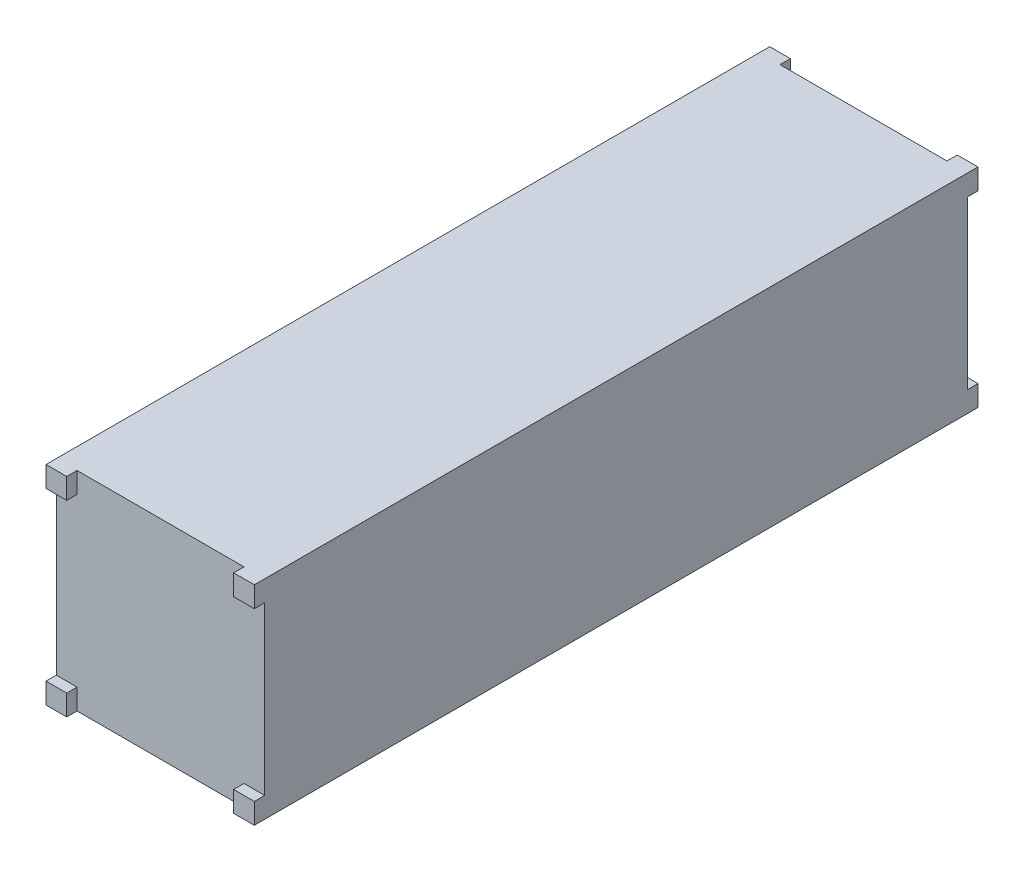
ISO-10303-21;
HEADER;
FILE_DESCRIPTION(('STEP AP214'),'2;1');
FILE_NAME('part.step','',(''),(''),'','','');
FILE_SCHEMA(('AUTOMOTIVE_DESIGN { 1 0 10303 214 1 1 1 1 }'));
ENDSEC;
DATA;
#1=APPLICATION_CONTEXT('core data for automotive mechanical design processes');
#2=APPLICATION_PROTOCOL_DEFINITION('international standard','automotive_design',2000,#1);
#3=PRODUCT_CONTEXT('',#1,'mechanical');
#4=PRODUCT('Part','Part','',(#3));
#5=PRODUCT_RELATED_PRODUCT_CATEGORY('part','',(#4));
#6=PRODUCT_DEFINITION_FORMATION('','',#4);
#7=PRODUCT_DEFINITION_CONTEXT('part definition',#1,'design');
#8=PRODUCT_DEFINITION('design','',#6,#7);
#9=PRODUCT_DEFINITION_SHAPE('','',#8);
#10=(LENGTH_UNIT() NAMED_UNIT(*) SI_UNIT(.MILLI.,.METRE.));
#11=(NAMED_UNIT(*) PLANE_ANGLE_UNIT() SI_UNIT($,.RADIAN.));
#12=(NAMED_UNIT(*) SI_UNIT($,.STERADIAN.) SOLID_ANGLE_UNIT());
#13=UNCERTAINTY_MEASURE_WITH_UNIT(LENGTH_MEASURE(1.E-05),#10,'distance_accuracy_value','');
#14=(GEOMETRIC_REPRESENTATION_CONTEXT(3) GLOBAL_UNCERTAINTY_ASSIGNED_CONTEXT((#13)) GLOBAL_UNIT_ASSIGNED_CONTEXT((#10,
#11,#12)) REPRESENTATION_CONTEXT('',''));
#15=CARTESIAN_POINT('',(0.,0.,0.));
#16=DIRECTION('',(0.,0.,1.));
#17=DIRECTION('',(1.,0.,0.));
#18=AXIS2_PLACEMENT_3D('',#15,#16,#17);
#19=CARTESIAN_POINT('',(0.,0.,-169.75));
#20=DIRECTION('',(0.,0.,1.));
#21=DIRECTION('',(1.,0.,0.));
#22=AXIS2_PLACEMENT_3D('',#19,#20,#21);
#23=PLANE('',#22);
#24=DIRECTION('',(0.,1.,0.));
#25=VECTOR('',#24,1.);
#26=CARTESIAN_POINT('',(40.3,-50.3,-169.75));
#27=LINE('',#26,#25);
#28=CARTESIAN_POINT('',(40.3,-50.3,-169.75));
#29=VERTEX_POINT('',#28);
#30=CARTESIAN_POINT('',(40.3,-40.3,-169.75));
#31=VERTEX_POINT('',#30);
#32=EDGE_CURVE('E240',#29,#31,#27,.T.);
#33=ORIENTED_EDGE('',*,*,#32,.F.);
#34=DIRECTION('',(1.,0.,0.));
#35=VECTOR('',#34,1.);
#36=CARTESIAN_POINT('',(50.3,-50.3,-169.75));
#37=LINE('',#36,#35);
#38=CARTESIAN_POINT('',(-40.2999999999999,-50.3,-169.75));
#39=VERTEX_POINT('',#38);
#40=EDGE_CURVE('E422',#39,#29,#37,.T.);
#41=ORIENTED_EDGE('',*,*,#40,.F.);
#42=DIRECTION('',(0.,-1.,0.));
#43=VECTOR('',#42,1.);
#44=CARTESIAN_POINT('',(-40.3,-50.3,-169.75));
#45=LINE('',#44,#43);
#46=CARTESIAN_POINT('',(-40.3,-40.3000000000001,-169.75));
#47=VERTEX_POINT('',#46);
#48=EDGE_CURVE('E256',#47,#39,#45,.T.);
#49=ORIENTED_EDGE('',*,*,#48,.F.);
#50=DIRECTION('',(1.,0.,0.));
#51=VECTOR('',#50,1.);
#52=CARTESIAN_POINT('',(-50.3,-40.3000000000001,-169.75));
#53=LINE('',#52,#51);
#54=CARTESIAN_POINT('',(-50.3,-40.3000000000001,-169.75));
#55=VERTEX_POINT('',#54);
#56=EDGE_CURVE('E251',#55,#47,#53,.T.);
#57=ORIENTED_EDGE('',*,*,#56,.F.);
#58=DIRECTION('',(0.,-1.,0.));
#59=VECTOR('',#58,1.);
#60=CARTESIAN_POINT('',(-50.3,-50.3,-169.75));
#61=LINE('',#60,#59);
#62=CARTESIAN_POINT('',(-50.3,40.3000000000001,-169.75));
#63=VERTEX_POINT('',#62);
#64=EDGE_CURVE('E409',#63,#55,#61,.T.);
#65=ORIENTED_EDGE('',*,*,#64,.F.);
#66=DIRECTION('',(-1.,0.,0.));
#67=VECTOR('',#66,1.);
#68=CARTESIAN_POINT('',(-50.3,40.3000000000001,-169.75));
#69=LINE('',#68,#67);
#70=CARTESIAN_POINT('',(-40.3,40.3000000000001,-169.75));
#71=VERTEX_POINT('',#70);
#72=EDGE_CURVE('E275',#71,#63,#69,.T.);
#73=ORIENTED_EDGE('',*,*,#72,.F.);
#74=DIRECTION('',(0.,-1.,0.));
#75=VECTOR('',#74,1.);
#76=CARTESIAN_POINT('',(-40.2999999999999,50.3000000000001,-169.75));
#77=LINE('',#76,#75);
#78=CARTESIAN_POINT('',(-40.2999999999999,50.3000000000001,-169.75));
#79=VERTEX_POINT('',#78);
#80=EDGE_CURVE('E270',#79,#71,#77,.T.);
#81=ORIENTED_EDGE('',*,*,#80,.F.);
#82=DIRECTION('',(-1.,0.,0.));
#83=VECTOR('',#82,1.);
#84=CARTESIAN_POINT('',(50.3,50.3,-169.75));
#85=LINE('',#84,#83);
#86=CARTESIAN_POINT('',(40.3,50.3,-169.75));
#87=VERTEX_POINT('',#86);
#88=EDGE_CURVE('E413',#87,#79,#85,.T.);
#89=ORIENTED_EDGE('',*,*,#88,.F.);
#90=DIRECTION('',(0.,1.,0.));
#91=VECTOR('',#90,1.);
#92=CARTESIAN_POINT('',(40.3,50.3,-169.75));
#93=LINE('',#92,#91);
#94=CARTESIAN_POINT('',(40.3,40.3,-169.75));
#95=VERTEX_POINT('',#94);
#96=EDGE_CURVE('E296',#95,#87,#93,.T.);
#97=ORIENTED_EDGE('',*,*,#96,.F.);
#98=DIRECTION('',(-1.,0.,0.));
#99=VECTOR('',#98,1.);
#100=CARTESIAN_POINT('',(50.3,40.3,-169.75));
#101=LINE('',#100,#99);
#102=CARTESIAN_POINT('',(50.3,40.3,-169.75));
#103=VERTEX_POINT('',#102);
#104=EDGE_CURVE('E291',#103,#95,#101,.T.);
#105=ORIENTED_EDGE('',*,*,#104,.F.);
#106=DIRECTION('',(0.,1.,0.));
#107=VECTOR('',#106,1.);
#108=CARTESIAN_POINT('',(50.3,-50.3,-169.75));
#109=LINE('',#108,#107);
#110=CARTESIAN_POINT('',(50.3,-40.3,-169.75));
#111=VERTEX_POINT('',#110);
#112=EDGE_CURVE('E424',#111,#103,#109,.T.);
#113=ORIENTED_EDGE('',*,*,#112,.F.);
#114=DIRECTION('',(1.,0.,0.));
#115=VECTOR('',#114,1.);
#116=CARTESIAN_POINT('',(50.3,-40.3,-169.75));
#117=LINE('',#116,#115);
#118=EDGE_CURVE('E238',#31,#111,#117,.T.);
#119=ORIENTED_EDGE('',*,*,#118,.F.);
#120=EDGE_LOOP('',(#33,#41,#49,#57,#65,#73,#81,#89,#97,#105,#113,#119));
#121=FACE_BOUND('',#120,.T.);
#122=ADVANCED_FACE('F33',(#121),#23,.F.);
#123=CARTESIAN_POINT('',(0.,0.,169.75));
#124=DIRECTION('',(0.,0.,1.));
#125=DIRECTION('',(1.,0.,0.));
#126=AXIS2_PLACEMENT_3D('',#123,#124,#125);
#127=PLANE('',#126);
#128=DIRECTION('',(-1.,0.,0.));
#129=VECTOR('',#128,1.);
#130=CARTESIAN_POINT('',(-50.3,-40.3,169.75));
#131=LINE('',#130,#129);
#132=CARTESIAN_POINT('',(-40.3,-40.3,169.75));
#133=VERTEX_POINT('',#132);
#134=CARTESIAN_POINT('',(-50.3,-40.3,169.75));
#135=VERTEX_POINT('',#134);
#136=EDGE_CURVE('E321',#133,#135,#131,.T.);
#137=ORIENTED_EDGE('',*,*,#136,.F.);
#138=DIRECTION('',(0.,1.,0.));
#139=VECTOR('',#138,1.);
#140=CARTESIAN_POINT('',(-40.3,-50.3,169.75));
#141=LINE('',#140,#139);
#142=CARTESIAN_POINT('',(-40.3,-50.3,169.75));
#143=VERTEX_POINT('',#142);
#144=EDGE_CURVE('E316',#143,#133,#141,.T.);
#145=ORIENTED_EDGE('',*,*,#144,.F.);
#146=DIRECTION('',(1.,0.,0.));
#147=VECTOR('',#146,1.);
#148=CARTESIAN_POINT('',(50.3,-50.3,169.75));
#149=LINE('',#148,#147);
#150=CARTESIAN_POINT('',(40.3,-50.3,169.75));
#151=VERTEX_POINT('',#150);
#152=EDGE_CURVE('E412',#143,#151,#149,.T.);
#153=ORIENTED_EDGE('',*,*,#152,.T.);
#154=DIRECTION('',(0.,-1.,0.));
#155=VECTOR('',#154,1.);
#156=CARTESIAN_POINT('',(40.3,-50.3,169.75));
#157=LINE('',#156,#155);
#158=CARTESIAN_POINT('',(40.3,-40.3,169.75));
#159=VERTEX_POINT('',#158);
#160=EDGE_CURVE('E343',#159,#151,#157,.T.);
#161=ORIENTED_EDGE('',*,*,#160,.F.);
#162=DIRECTION('',(-1.,0.,0.));
#163=VECTOR('',#162,1.);
#164=CARTESIAN_POINT('',(50.3,-40.3,169.75));
#165=LINE('',#164,#163);
#166=CARTESIAN_POINT('',(50.3,-40.3,169.75));
#167=VERTEX_POINT('',#166);
#168=EDGE_CURVE('E340',#167,#159,#165,.T.);
#169=ORIENTED_EDGE('',*,*,#168,.F.);
#170=DIRECTION('',(0.,1.,0.));
#171=VECTOR('',#170,1.);
#172=CARTESIAN_POINT('',(50.3,-50.3,169.75));
#173=LINE('',#172,#171);
#174=CARTESIAN_POINT('',(50.3,40.3,169.75));
#175=VERTEX_POINT('',#174);
#176=EDGE_CURVE('E415',#167,#175,#173,.T.);
#177=ORIENTED_EDGE('',*,*,#176,.T.);
#178=DIRECTION('',(1.,0.,0.));
#179=VECTOR('',#178,1.);
#180=CARTESIAN_POINT('',(50.3,40.3,169.75));
#181=LINE('',#180,#179);
#182=CARTESIAN_POINT('',(40.3,40.3,169.75));
#183=VERTEX_POINT('',#182);
#184=EDGE_CURVE('E367',#183,#175,#181,.T.);
#185=ORIENTED_EDGE('',*,*,#184,.F.);
#186=DIRECTION('',(0.,-1.,0.));
#187=VECTOR('',#186,1.);
#188=CARTESIAN_POINT('',(40.3,50.3,169.75));
#189=LINE('',#188,#187);
#190=CARTESIAN_POINT('',(40.3,50.3,169.75));
#191=VERTEX_POINT('',#190);
#192=EDGE_CURVE('E362',#191,#183,#189,.T.);
#193=ORIENTED_EDGE('',*,*,#192,.F.);
#194=DIRECTION('',(-1.,0.,0.));
#195=VECTOR('',#194,1.);
#196=CARTESIAN_POINT('',(50.3,50.3,169.75));
#197=LINE('',#196,#195);
#198=CARTESIAN_POINT('',(-40.2999999999999,50.3,169.75));
#199=VERTEX_POINT('',#198);
#200=EDGE_CURVE('E417',#191,#199,#197,.T.);
#201=ORIENTED_EDGE('',*,*,#200,.T.);
#202=DIRECTION('',(0.,1.,0.));
#203=VECTOR('',#202,1.);
#204=CARTESIAN_POINT('',(-40.3,50.3,169.75));
#205=LINE('',#204,#203);
#206=CARTESIAN_POINT('',(-40.3,40.3,169.75));
#207=VERTEX_POINT('',#206);
#208=EDGE_CURVE('E389',#207,#199,#205,.T.);
#209=ORIENTED_EDGE('',*,*,#208,.F.);
#210=DIRECTION('',(1.,0.,0.));
#211=VECTOR('',#210,1.);
#212=CARTESIAN_POINT('',(-50.3,40.3,169.75));
#213=LINE('',#212,#211);
#214=CARTESIAN_POINT('',(-50.3,40.3,169.75));
#215=VERTEX_POINT('',#214);
#216=EDGE_CURVE('E384',#215,#207,#213,.T.);
#217=ORIENTED_EDGE('',*,*,#216,.F.);
#218=DIRECTION('',(0.,-1.,0.));
#219=VECTOR('',#218,1.);
#220=CARTESIAN_POINT('',(-50.3,-50.3,169.75));
#221=LINE('',#220,#219);
#222=EDGE_CURVE('E410',#215,#135,#221,.T.);
#223=ORIENTED_EDGE('',*,*,#222,.T.);
#224=EDGE_LOOP('',(#137,#145,#153,#161,#169,#177,#185,#193,#201,#209,#217,#223));
#225=FACE_BOUND('',#224,.T.);
#226=ADVANCED_FACE('F484',(#225),#127,.T.);
#227=CARTESIAN_POINT('',(-50.3,-50.3,169.75));
#228=DIRECTION('',(1.,0.,0.));
#229=DIRECTION('',(0.,0.,-1.));
#230=AXIS2_PLACEMENT_3D('',#227,#228,#229);
#231=PLANE('',#230);
#232=DIRECTION('',(0.,0.,-1.));
#233=VECTOR('',#232,1.);
#234=CARTESIAN_POINT('',(-50.3,50.3,169.75));
#235=LINE('',#234,#233);
#236=CARTESIAN_POINT('',(-50.3,50.3,174.75));
#237=VERTEX_POINT('',#236);
#238=CARTESIAN_POINT('',(-50.2999999999999,50.3000000000001,-174.75));
#239=VERTEX_POINT('',#238);
#240=EDGE_CURVE('E419',#237,#239,#235,.T.);
#241=ORIENTED_EDGE('',*,*,#240,.T.);
#242=DIRECTION('',(0.,1.,0.));
#243=VECTOR('',#242,1.);
#244=CARTESIAN_POINT('',(-50.2999999999999,50.3000000000001,-174.75));
#245=LINE('',#244,#243);
#246=CARTESIAN_POINT('',(-50.3,40.3000000000001,-174.75));
#247=VERTEX_POINT('',#246);
#248=EDGE_CURVE('E271',#247,#239,#245,.T.);
#249=ORIENTED_EDGE('',*,*,#248,.F.);
#250=DIRECTION('',(0.,0.,1.));
#251=VECTOR('',#250,1.);
#252=CARTESIAN_POINT('',(-50.3,40.3000000000001,-174.75));
#253=LINE('',#252,#251);
#254=EDGE_CURVE('E281',#247,#63,#253,.T.);
#255=ORIENTED_EDGE('',*,*,#254,.T.);
#256=ORIENTED_EDGE('',*,*,#64,.T.);
#257=DIRECTION('',(0.,0.,1.));
#258=VECTOR('',#257,1.);
#259=CARTESIAN_POINT('',(-50.3,-40.3000000000001,-174.75));
#260=LINE('',#259,#258);
#261=CARTESIAN_POINT('',(-50.3,-40.3000000000001,-174.75));
#262=VERTEX_POINT('',#261);
#263=EDGE_CURVE('E268',#262,#55,#260,.T.);
#264=ORIENTED_EDGE('',*,*,#263,.F.);
#265=DIRECTION('',(0.,1.,0.));
#266=VECTOR('',#265,1.);
#267=CARTESIAN_POINT('',(-50.3,-50.3000000000001,-174.75));
#268=LINE('',#267,#266);
#269=CARTESIAN_POINT('',(-50.3,-50.3000000000001,-174.75));
#270=VERTEX_POINT('',#269);
#271=EDGE_CURVE('E255',#270,#262,#268,.T.);
#272=ORIENTED_EDGE('',*,*,#271,.F.);
#273=DIRECTION('',(0.,0.,-1.));
#274=VECTOR('',#273,1.);
#275=CARTESIAN_POINT('',(-50.3,-50.3,169.75));
#276=LINE('',#275,#274);
#277=CARTESIAN_POINT('',(-50.3,-50.3,174.75));
#278=VERTEX_POINT('',#277);
#279=EDGE_CURVE('E11',#278,#270,#276,.T.);
#280=ORIENTED_EDGE('',*,*,#279,.F.);
#281=DIRECTION('',(0.,-1.,0.));
#282=VECTOR('',#281,1.);
#283=CARTESIAN_POINT('',(-50.3,-50.3,174.75));
#284=LINE('',#283,#282);
#285=CARTESIAN_POINT('',(-50.3,-40.3,174.75));
#286=VERTEX_POINT('',#285);
#287=EDGE_CURVE('E317',#286,#278,#284,.T.);
#288=ORIENTED_EDGE('',*,*,#287,.F.);
#289=DIRECTION('',(0.,0.,-1.));
#290=VECTOR('',#289,1.);
#291=CARTESIAN_POINT('',(-50.3,-40.3,174.75));
#292=LINE('',#291,#290);
#293=EDGE_CURVE('E327',#286,#135,#292,.T.);
#294=ORIENTED_EDGE('',*,*,#293,.T.);
#295=ORIENTED_EDGE('',*,*,#222,.F.);
#296=DIRECTION('',(0.,0.,-1.));
#297=VECTOR('',#296,1.);
#298=CARTESIAN_POINT('',(-50.3,40.3,174.75));
#299=LINE('',#298,#297);
#300=CARTESIAN_POINT('',(-50.3,40.3,174.75));
#301=VERTEX_POINT('',#300);
#302=EDGE_CURVE('E406',#301,#215,#299,.T.);
#303=ORIENTED_EDGE('',*,*,#302,.F.);
#304=DIRECTION('',(0.,-1.,0.));
#305=VECTOR('',#304,1.);
#306=CARTESIAN_POINT('',(-50.3,50.3,174.75));
#307=LINE('',#306,#305);
#308=EDGE_CURVE('E385',#237,#301,#307,.T.);
#309=ORIENTED_EDGE('',*,*,#308,.F.);
#310=EDGE_LOOP('',(#241,#249,#255,#256,#264,#272,#280,#288,#294,#295,#303,#309));
#311=FACE_BOUND('',#310,.T.);
#312=ADVANCED_FACE('F35',(#311),#231,.F.);
#313=CARTESIAN_POINT('',(50.3,-50.3,169.75));
#314=DIRECTION('',(0.,1.,0.));
#315=DIRECTION('',(0.,0.,1.));
#316=AXIS2_PLACEMENT_3D('',#313,#314,#315);
#317=PLANE('',#316);
#318=ORIENTED_EDGE('',*,*,#279,.T.);
#319=DIRECTION('',(-1.,0.,0.));
#320=VECTOR('',#319,1.);
#321=CARTESIAN_POINT('',(-50.3,-50.3000000000001,-174.75));
#322=LINE('',#321,#320);
#323=CARTESIAN_POINT('',(-40.3,-50.3,-174.75));
#324=VERTEX_POINT('',#323);
#325=EDGE_CURVE('E252',#324,#270,#322,.T.);
#326=ORIENTED_EDGE('',*,*,#325,.F.);
#327=DIRECTION('',(0.,0.,1.));
#328=VECTOR('',#327,1.);
#329=CARTESIAN_POINT('',(-40.3,-50.3,-174.75));
#330=LINE('',#329,#328);
#331=EDGE_CURVE('E56',#324,#39,#330,.T.);
#332=ORIENTED_EDGE('',*,*,#331,.T.);
#333=ORIENTED_EDGE('',*,*,#40,.T.);
#334=DIRECTION('',(0.,0.,1.));
#335=VECTOR('',#334,1.);
#336=CARTESIAN_POINT('',(40.3,-50.3,-174.75));
#337=LINE('',#336,#335);
#338=CARTESIAN_POINT('',(40.3,-50.3,-174.75));
#339=VERTEX_POINT('',#338);
#340=EDGE_CURVE('E230',#339,#29,#337,.T.);
#341=ORIENTED_EDGE('',*,*,#340,.F.);
#342=DIRECTION('',(-1.,0.,0.));
#343=VECTOR('',#342,1.);
#344=CARTESIAN_POINT('',(50.3,-50.3,-174.75));
#345=LINE('',#344,#343);
#346=CARTESIAN_POINT('',(50.3,-50.3,-174.75));
#347=VERTEX_POINT('',#346);
#348=EDGE_CURVE('E228',#347,#339,#345,.T.);
#349=ORIENTED_EDGE('',*,*,#348,.F.);
#350=DIRECTION('',(0.,0.,-1.));
#351=VECTOR('',#350,1.);
#352=CARTESIAN_POINT('',(50.3,-50.3,169.75));
#353=LINE('',#352,#351);
#354=CARTESIAN_POINT('',(50.3,-50.3,174.75));
#355=VERTEX_POINT('',#354);
#356=EDGE_CURVE('E41',#355,#347,#353,.T.);
#357=ORIENTED_EDGE('',*,*,#356,.F.);
#358=DIRECTION('',(1.,0.,0.));
#359=VECTOR('',#358,1.);
#360=CARTESIAN_POINT('',(50.3,-50.3,174.75));
#361=LINE('',#360,#359);
#362=CARTESIAN_POINT('',(40.3,-50.3,174.75));
#363=VERTEX_POINT('',#362);
#364=EDGE_CURVE('E341',#363,#355,#361,.T.);
#365=ORIENTED_EDGE('',*,*,#364,.F.);
#366=DIRECTION('',(0.,0.,-1.));
#367=VECTOR('',#366,1.);
#368=CARTESIAN_POINT('',(40.3,-50.3,174.75));
#369=LINE('',#368,#367);
#370=EDGE_CURVE('E349',#363,#151,#369,.T.);
#371=ORIENTED_EDGE('',*,*,#370,.T.);
#372=ORIENTED_EDGE('',*,*,#152,.F.);
#373=DIRECTION('',(0.,0.,-1.));
#374=VECTOR('',#373,1.);
#375=CARTESIAN_POINT('',(-40.3,-50.3,174.75));
#376=LINE('',#375,#374);
#377=CARTESIAN_POINT('',(-40.3,-50.3,174.75));
#378=VERTEX_POINT('',#377);
#379=EDGE_CURVE('E337',#378,#143,#376,.T.);
#380=ORIENTED_EDGE('',*,*,#379,.F.);
#381=DIRECTION('',(1.,0.,0.));
#382=VECTOR('',#381,1.);
#383=CARTESIAN_POINT('',(-50.3,-50.3,174.75));
#384=LINE('',#383,#382);
#385=EDGE_CURVE('E320',#278,#378,#384,.T.);
#386=ORIENTED_EDGE('',*,*,#385,.F.);
#387=EDGE_LOOP('',(#318,#326,#332,#333,#341,#349,#357,#365,#371,#372,#380,#386));
#388=FACE_BOUND('',#387,.T.);
#389=ADVANCED_FACE('F229',(#388),#317,.F.);
#390=CARTESIAN_POINT('',(50.3,-50.3,169.75));
#391=DIRECTION('',(-1.,0.,0.));
#392=DIRECTION('',(0.,0.,1.));
#393=AXIS2_PLACEMENT_3D('',#390,#391,#392);
#394=PLANE('',#393);
#395=ORIENTED_EDGE('',*,*,#356,.T.);
#396=DIRECTION('',(0.,-1.,0.));
#397=VECTOR('',#396,1.);
#398=CARTESIAN_POINT('',(50.3,-50.3,-174.75));
#399=LINE('',#398,#397);
#400=CARTESIAN_POINT('',(50.3,-40.3,-174.75));
#401=VERTEX_POINT('',#400);
#402=EDGE_CURVE('E221',#401,#347,#399,.T.);
#403=ORIENTED_EDGE('',*,*,#402,.F.);
#404=DIRECTION('',(0.,0.,1.));
#405=VECTOR('',#404,1.);
#406=CARTESIAN_POINT('',(50.3,-40.3,-174.75));
#407=LINE('',#406,#405);
#408=EDGE_CURVE('E48',#401,#111,#407,.T.);
#409=ORIENTED_EDGE('',*,*,#408,.T.);
#410=ORIENTED_EDGE('',*,*,#112,.T.);
#411=DIRECTION('',(0.,0.,1.));
#412=VECTOR('',#411,1.);
#413=CARTESIAN_POINT('',(50.3,40.3,-174.75));
#414=LINE('',#413,#412);
#415=CARTESIAN_POINT('',(50.3,40.3,-174.75));
#416=VERTEX_POINT('',#415);
#417=EDGE_CURVE('E313',#416,#103,#414,.T.);
#418=ORIENTED_EDGE('',*,*,#417,.F.);
#419=DIRECTION('',(0.,-1.,0.));
#420=VECTOR('',#419,1.);
#421=CARTESIAN_POINT('',(50.3,50.3,-174.75));
#422=LINE('',#421,#420);
#423=CARTESIAN_POINT('',(50.3,50.3,-174.75));
#424=VERTEX_POINT('',#423);
#425=EDGE_CURVE('E292',#424,#416,#422,.T.);
#426=ORIENTED_EDGE('',*,*,#425,.F.);
#427=DIRECTION('',(0.,0.,-1.));
#428=VECTOR('',#427,1.);
#429=CARTESIAN_POINT('',(50.3,50.3,169.75));
#430=LINE('',#429,#428);
#431=CARTESIAN_POINT('',(50.3,50.3,174.75));
#432=VERTEX_POINT('',#431);
#433=EDGE_CURVE('E226',#432,#424,#430,.T.);
#434=ORIENTED_EDGE('',*,*,#433,.F.);
#435=DIRECTION('',(0.,1.,0.));
#436=VECTOR('',#435,1.);
#437=CARTESIAN_POINT('',(50.3,50.3,174.75));
#438=LINE('',#437,#436);
#439=CARTESIAN_POINT('',(50.3,40.3,174.75));
#440=VERTEX_POINT('',#439);
#441=EDGE_CURVE('E363',#440,#432,#438,.T.);
#442=ORIENTED_EDGE('',*,*,#441,.F.);
#443=DIRECTION('',(0.,0.,-1.));
#444=VECTOR('',#443,1.);
#445=CARTESIAN_POINT('',(50.3,40.3,174.75));
#446=LINE('',#445,#444);
#447=EDGE_CURVE('E373',#440,#175,#446,.T.);
#448=ORIENTED_EDGE('',*,*,#447,.T.);
#449=ORIENTED_EDGE('',*,*,#176,.F.);
#450=DIRECTION('',(0.,0.,-1.));
#451=VECTOR('',#450,1.);
#452=CARTESIAN_POINT('',(50.3,-40.3,174.75));
#453=LINE('',#452,#451);
#454=CARTESIAN_POINT('',(50.3,-40.3,174.75));
#455=VERTEX_POINT('',#454);
#456=EDGE_CURVE('E359',#455,#167,#453,.T.);
#457=ORIENTED_EDGE('',*,*,#456,.F.);
#458=DIRECTION('',(0.,1.,0.));
#459=VECTOR('',#458,1.);
#460=CARTESIAN_POINT('',(50.3,-50.3,174.75));
#461=LINE('',#460,#459);
#462=EDGE_CURVE('E223',#355,#455,#461,.T.);
#463=ORIENTED_EDGE('',*,*,#462,.F.);
#464=EDGE_LOOP('',(#395,#403,#409,#410,#418,#426,#434,#442,#448,#449,#457,#463));
#465=FACE_BOUND('',#464,.T.);
#466=ADVANCED_FACE('F219',(#465),#394,.F.);
#467=CARTESIAN_POINT('',(50.3,50.3,169.75));
#468=DIRECTION('',(0.,-1.,0.));
#469=DIRECTION('',(1.,0.,0.));
#470=AXIS2_PLACEMENT_3D('',#467,#468,#469);
#471=PLANE('',#470);
#472=ORIENTED_EDGE('',*,*,#433,.T.);
#473=DIRECTION('',(1.,0.,0.));
#474=VECTOR('',#473,1.);
#475=CARTESIAN_POINT('',(50.3,50.3,-174.75));
#476=LINE('',#475,#474);
#477=CARTESIAN_POINT('',(40.3,50.3,-174.75));
#478=VERTEX_POINT('',#477);
#479=EDGE_CURVE('E300',#478,#424,#476,.T.);
#480=ORIENTED_EDGE('',*,*,#479,.F.);
#481=DIRECTION('',(0.,0.,1.));
#482=VECTOR('',#481,1.);
#483=CARTESIAN_POINT('',(40.3,50.3,-174.75));
#484=LINE('',#483,#482);
#485=EDGE_CURVE('E303',#478,#87,#484,.T.);
#486=ORIENTED_EDGE('',*,*,#485,.T.);
#487=ORIENTED_EDGE('',*,*,#88,.T.);
#488=DIRECTION('',(0.,0.,1.));
#489=VECTOR('',#488,1.);
#490=CARTESIAN_POINT('',(-40.2999999999999,50.3000000000001,-174.75));
#491=LINE('',#490,#489);
#492=CARTESIAN_POINT('',(-40.2999999999999,50.3000000000001,-174.75));
#493=VERTEX_POINT('',#492);
#494=EDGE_CURVE('E289',#493,#79,#491,.T.);
#495=ORIENTED_EDGE('',*,*,#494,.F.);
#496=DIRECTION('',(1.,0.,0.));
#497=VECTOR('',#496,1.);
#498=CARTESIAN_POINT('',(-50.2999999999999,50.3000000000001,-174.75));
#499=LINE('',#498,#497);
#500=EDGE_CURVE('E274',#239,#493,#499,.T.);
#501=ORIENTED_EDGE('',*,*,#500,.F.);
#502=ORIENTED_EDGE('',*,*,#240,.F.);
#503=DIRECTION('',(-1.,0.,0.));
#504=VECTOR('',#503,1.);
#505=CARTESIAN_POINT('',(-50.3,50.3,174.75));
#506=LINE('',#505,#504);
#507=CARTESIAN_POINT('',(-40.3,50.3,174.75));
#508=VERTEX_POINT('',#507);
#509=EDGE_CURVE('E393',#508,#237,#506,.T.);
#510=ORIENTED_EDGE('',*,*,#509,.F.);
#511=DIRECTION('',(0.,0.,-1.));
#512=VECTOR('',#511,1.);
#513=CARTESIAN_POINT('',(-40.3,50.3,174.75));
#514=LINE('',#513,#512);
#515=EDGE_CURVE('E396',#508,#199,#514,.T.);
#516=ORIENTED_EDGE('',*,*,#515,.T.);
#517=ORIENTED_EDGE('',*,*,#200,.F.);
#518=DIRECTION('',(0.,0.,-1.));
#519=VECTOR('',#518,1.);
#520=CARTESIAN_POINT('',(40.3,50.3,174.75));
#521=LINE('',#520,#519);
#522=CARTESIAN_POINT('',(40.3,50.3,174.75));
#523=VERTEX_POINT('',#522);
#524=EDGE_CURVE('E382',#523,#191,#521,.T.);
#525=ORIENTED_EDGE('',*,*,#524,.F.);
#526=DIRECTION('',(-1.,0.,0.));
#527=VECTOR('',#526,1.);
#528=CARTESIAN_POINT('',(50.3,50.3,174.75));
#529=LINE('',#528,#527);
#530=EDGE_CURVE('E366',#432,#523,#529,.T.);
#531=ORIENTED_EDGE('',*,*,#530,.F.);
#532=EDGE_LOOP('',(#472,#480,#486,#487,#495,#501,#502,#510,#516,#517,#525,#531));
#533=FACE_BOUND('',#532,.T.);
#534=ADVANCED_FACE('F432',(#533),#471,.F.);
#535=CARTESIAN_POINT('',(-50.3,40.3,174.75));
#536=DIRECTION('',(0.,1.,0.));
#537=DIRECTION('',(0.,0.,1.));
#538=AXIS2_PLACEMENT_3D('',#535,#536,#537);
#539=PLANE('',#538);
#540=ORIENTED_EDGE('',*,*,#216,.T.);
#541=DIRECTION('',(0.,0.,-1.));
#542=VECTOR('',#541,1.);
#543=CARTESIAN_POINT('',(-40.3,40.3,174.75));
#544=LINE('',#543,#542);
#545=CARTESIAN_POINT('',(-40.3,40.3,174.75));
#546=VERTEX_POINT('',#545);
#547=EDGE_CURVE('E403',#546,#207,#544,.T.);
#548=ORIENTED_EDGE('',*,*,#547,.F.);
#549=DIRECTION('',(1.,0.,0.));
#550=VECTOR('',#549,1.);
#551=CARTESIAN_POINT('',(-50.3,40.3,174.75));
#552=LINE('',#551,#550);
#553=EDGE_CURVE('E388',#301,#546,#552,.T.);
#554=ORIENTED_EDGE('',*,*,#553,.F.);
#555=ORIENTED_EDGE('',*,*,#302,.T.);
#556=EDGE_LOOP('',(#540,#548,#554,#555));
#557=FACE_BOUND('',#556,.T.);
#558=ADVANCED_FACE('F476',(#557),#539,.F.);
#559=CARTESIAN_POINT('',(-40.3,50.3,174.75));
#560=DIRECTION('',(-1.,0.,0.));
#561=DIRECTION('',(0.,0.,1.));
#562=AXIS2_PLACEMENT_3D('',#559,#560,#561);
#563=PLANE('',#562);
#564=ORIENTED_EDGE('',*,*,#208,.T.);
#565=ORIENTED_EDGE('',*,*,#515,.F.);
#566=DIRECTION('',(0.,1.,0.));
#567=VECTOR('',#566,1.);
#568=CARTESIAN_POINT('',(-40.3,50.3,174.75));
#569=LINE('',#568,#567);
#570=EDGE_CURVE('E391',#546,#508,#569,.T.);
#571=ORIENTED_EDGE('',*,*,#570,.F.);
#572=ORIENTED_EDGE('',*,*,#547,.T.);
#573=EDGE_LOOP('',(#564,#565,#571,#572));
#574=FACE_BOUND('',#573,.T.);
#575=ADVANCED_FACE('F479',(#574),#563,.F.);
#576=CARTESIAN_POINT('',(0.,0.,174.75));
#577=DIRECTION('',(0.,0.,1.));
#578=DIRECTION('',(1.,0.,0.));
#579=AXIS2_PLACEMENT_3D('',#576,#577,#578);
#580=PLANE('',#579);
#581=ORIENTED_EDGE('',*,*,#308,.T.);
#582=ORIENTED_EDGE('',*,*,#553,.T.);
#583=ORIENTED_EDGE('',*,*,#570,.T.);
#584=ORIENTED_EDGE('',*,*,#509,.T.);
#585=EDGE_LOOP('',(#581,#582,#583,#584));
#586=FACE_BOUND('',#585,.T.);
#587=ADVANCED_FACE('F470',(#586),#580,.T.);
#588=CARTESIAN_POINT('',(40.3,50.3,174.75));
#589=DIRECTION('',(1.,0.,0.));
#590=DIRECTION('',(0.,0.,-1.));
#591=AXIS2_PLACEMENT_3D('',#588,#589,#590);
#592=PLANE('',#591);
#593=ORIENTED_EDGE('',*,*,#192,.T.);
#594=DIRECTION('',(0.,0.,-1.));
#595=VECTOR('',#594,1.);
#596=CARTESIAN_POINT('',(40.3,40.3,174.75));
#597=LINE('',#596,#595);
#598=CARTESIAN_POINT('',(40.3,40.3,174.75));
#599=VERTEX_POINT('',#598);
#600=EDGE_CURVE('E380',#599,#183,#597,.T.);
#601=ORIENTED_EDGE('',*,*,#600,.F.);
#602=DIRECTION('',(0.,-1.,0.));
#603=VECTOR('',#602,1.);
#604=CARTESIAN_POINT('',(40.3,50.3,174.75));
#605=LINE('',#604,#603);
#606=EDGE_CURVE('E369',#523,#599,#605,.T.);
#607=ORIENTED_EDGE('',*,*,#606,.F.);
#608=ORIENTED_EDGE('',*,*,#524,.T.);
#609=EDGE_LOOP('',(#593,#601,#607,#608));
#610=FACE_BOUND('',#609,.T.);
#611=ADVANCED_FACE('F488',(#610),#592,.F.);
#612=CARTESIAN_POINT('',(50.3,40.3,174.75));
#613=DIRECTION('',(0.,1.,0.));
#614=DIRECTION('',(-1.,0.,0.));
#615=AXIS2_PLACEMENT_3D('',#612,#613,#614);
#616=PLANE('',#615);
#617=ORIENTED_EDGE('',*,*,#184,.T.);
#618=ORIENTED_EDGE('',*,*,#447,.F.);
#619=DIRECTION('',(1.,0.,0.));
#620=VECTOR('',#619,1.);
#621=CARTESIAN_POINT('',(50.3,40.3,174.75));
#622=LINE('',#621,#620);
#623=EDGE_CURVE('E371',#599,#440,#622,.T.);
#624=ORIENTED_EDGE('',*,*,#623,.F.);
#625=ORIENTED_EDGE('',*,*,#600,.T.);
#626=EDGE_LOOP('',(#617,#618,#624,#625));
#627=FACE_BOUND('',#626,.T.);
#628=ADVANCED_FACE('F495',(#627),#616,.F.);
#629=CARTESIAN_POINT('',(0.,0.,174.75));
#630=DIRECTION('',(0.,0.,-1.));
#631=DIRECTION('',(-1.,0.,0.));
#632=AXIS2_PLACEMENT_3D('',#629,#630,#631);
#633=PLANE('',#632);
#634=ORIENTED_EDGE('',*,*,#441,.T.);
#635=ORIENTED_EDGE('',*,*,#530,.T.);
#636=ORIENTED_EDGE('',*,*,#606,.T.);
#637=ORIENTED_EDGE('',*,*,#623,.T.);
#638=EDGE_LOOP('',(#634,#635,#636,#637));
#639=FACE_BOUND('',#638,.T.);
#640=ADVANCED_FACE('F491',(#639),#633,.F.);
#641=CARTESIAN_POINT('',(50.3,-40.3,174.75));
#642=DIRECTION('',(0.,-1.,0.));
#643=DIRECTION('',(1.,0.,0.));
#644=AXIS2_PLACEMENT_3D('',#641,#642,#643);
#645=PLANE('',#644);
#646=ORIENTED_EDGE('',*,*,#168,.T.);
#647=DIRECTION('',(0.,0.,-1.));
#648=VECTOR('',#647,1.);
#649=CARTESIAN_POINT('',(40.3,-40.3,174.75));
#650=LINE('',#649,#648);
#651=CARTESIAN_POINT('',(40.3,-40.3,174.75));
#652=VERTEX_POINT('',#651);
#653=EDGE_CURVE('E356',#652,#159,#650,.T.);
#654=ORIENTED_EDGE('',*,*,#653,.F.);
#655=DIRECTION('',(-1.,0.,0.));
#656=VECTOR('',#655,1.);
#657=CARTESIAN_POINT('',(50.3,-40.3,174.75));
#658=LINE('',#657,#656);
#659=EDGE_CURVE('E345',#455,#652,#658,.T.);
#660=ORIENTED_EDGE('',*,*,#659,.F.);
#661=ORIENTED_EDGE('',*,*,#456,.T.);
#662=EDGE_LOOP('',(#646,#654,#660,#661));
#663=FACE_BOUND('',#662,.T.);
#664=ADVANCED_FACE('F502',(#663),#645,.F.);
#665=CARTESIAN_POINT('',(40.3,-50.3,174.75));
#666=DIRECTION('',(1.,0.,0.));
#667=DIRECTION('',(0.,0.,-1.));
#668=AXIS2_PLACEMENT_3D('',#665,#666,#667);
#669=PLANE('',#668);
#670=ORIENTED_EDGE('',*,*,#160,.T.);
#671=ORIENTED_EDGE('',*,*,#370,.F.);
#672=DIRECTION('',(0.,-1.,0.));
#673=VECTOR('',#672,1.);
#674=CARTESIAN_POINT('',(40.3,-50.3,174.75));
#675=LINE('',#674,#673);
#676=EDGE_CURVE('E347',#652,#363,#675,.T.);
#677=ORIENTED_EDGE('',*,*,#676,.F.);
#678=ORIENTED_EDGE('',*,*,#653,.T.);
#679=EDGE_LOOP('',(#670,#671,#677,#678));
#680=FACE_BOUND('',#679,.T.);
#681=ADVANCED_FACE('F577',(#680),#669,.F.);
#682=CARTESIAN_POINT('',(0.,0.,174.75));
#683=DIRECTION('',(0.,0.,-1.));
#684=DIRECTION('',(-1.,0.,0.));
#685=AXIS2_PLACEMENT_3D('',#682,#683,#684);
#686=PLANE('',#685);
#687=ORIENTED_EDGE('',*,*,#364,.T.);
#688=ORIENTED_EDGE('',*,*,#462,.T.);
#689=ORIENTED_EDGE('',*,*,#659,.T.);
#690=ORIENTED_EDGE('',*,*,#676,.T.);
#691=EDGE_LOOP('',(#687,#688,#689,#690));
#692=FACE_BOUND('',#691,.T.);
#693=ADVANCED_FACE('F587',(#692),#686,.F.);
#694=CARTESIAN_POINT('',(-40.3,-50.3,174.75));
#695=DIRECTION('',(-1.,0.,0.));
#696=DIRECTION('',(0.,0.,1.));
#697=AXIS2_PLACEMENT_3D('',#694,#695,#696);
#698=PLANE('',#697);
#699=ORIENTED_EDGE('',*,*,#144,.T.);
#700=DIRECTION('',(0.,0.,-1.));
#701=VECTOR('',#700,1.);
#702=CARTESIAN_POINT('',(-40.3,-40.3,174.75));
#703=LINE('',#702,#701);
#704=CARTESIAN_POINT('',(-40.3,-40.3,174.75));
#705=VERTEX_POINT('',#704);
#706=EDGE_CURVE('E334',#705,#133,#703,.T.);
#707=ORIENTED_EDGE('',*,*,#706,.F.);
#708=DIRECTION('',(0.,1.,0.));
#709=VECTOR('',#708,1.);
#710=CARTESIAN_POINT('',(-40.3,-50.3,174.75));
#711=LINE('',#710,#709);
#712=EDGE_CURVE('E323',#378,#705,#711,.T.);
#713=ORIENTED_EDGE('',*,*,#712,.F.);
#714=ORIENTED_EDGE('',*,*,#379,.T.);
#715=EDGE_LOOP('',(#699,#707,#713,#714));
#716=FACE_BOUND('',#715,.T.);
#717=ADVANCED_FACE('F597',(#716),#698,.F.);
#718=CARTESIAN_POINT('',(-50.3,-40.3,174.75));
#719=DIRECTION('',(0.,-1.,0.));
#720=DIRECTION('',(0.,0.,-1.));
#721=AXIS2_PLACEMENT_3D('',#718,#719,#720);
#722=PLANE('',#721);
#723=ORIENTED_EDGE('',*,*,#136,.T.);
#724=ORIENTED_EDGE('',*,*,#293,.F.);
#725=DIRECTION('',(-1.,0.,0.));
#726=VECTOR('',#725,1.);
#727=CARTESIAN_POINT('',(-50.3,-40.3,174.75));
#728=LINE('',#727,#726);
#729=EDGE_CURVE('E325',#705,#286,#728,.T.);
#730=ORIENTED_EDGE('',*,*,#729,.F.);
#731=ORIENTED_EDGE('',*,*,#706,.T.);
#732=EDGE_LOOP('',(#723,#724,#730,#731));
#733=FACE_BOUND('',#732,.T.);
#734=ADVANCED_FACE('F607',(#733),#722,.F.);
#735=CARTESIAN_POINT('',(0.,0.,174.75));
#736=DIRECTION('',(0.,0.,-1.));
#737=DIRECTION('',(-1.,0.,0.));
#738=AXIS2_PLACEMENT_3D('',#735,#736,#737);
#739=PLANE('',#738);
#740=ORIENTED_EDGE('',*,*,#287,.T.);
#741=ORIENTED_EDGE('',*,*,#385,.T.);
#742=ORIENTED_EDGE('',*,*,#712,.T.);
#743=ORIENTED_EDGE('',*,*,#729,.T.);
#744=EDGE_LOOP('',(#740,#741,#742,#743));
#745=FACE_BOUND('',#744,.T.);
#746=ADVANCED_FACE('F617',(#745),#739,.F.);
#747=CARTESIAN_POINT('',(50.3,40.3,-174.75));
#748=DIRECTION('',(0.,1.,0.));
#749=DIRECTION('',(0.,0.,1.));
#750=AXIS2_PLACEMENT_3D('',#747,#748,#749);
#751=PLANE('',#750);
#752=ORIENTED_EDGE('',*,*,#104,.T.);
#753=DIRECTION('',(0.,0.,1.));
#754=VECTOR('',#753,1.);
#755=CARTESIAN_POINT('',(40.3,40.3,-174.75));
#756=LINE('',#755,#754);
#757=CARTESIAN_POINT('',(40.3,40.3,-174.75));
#758=VERTEX_POINT('',#757);
#759=EDGE_CURVE('E310',#758,#95,#756,.T.);
#760=ORIENTED_EDGE('',*,*,#759,.F.);
#761=DIRECTION('',(-1.,0.,0.));
#762=VECTOR('',#761,1.);
#763=CARTESIAN_POINT('',(50.3,40.3,-174.75));
#764=LINE('',#763,#762);
#765=EDGE_CURVE('E295',#416,#758,#764,.T.);
#766=ORIENTED_EDGE('',*,*,#765,.F.);
#767=ORIENTED_EDGE('',*,*,#417,.T.);
#768=EDGE_LOOP('',(#752,#760,#766,#767));
#769=FACE_BOUND('',#768,.T.);
#770=ADVANCED_FACE('F444',(#769),#751,.F.);
#771=CARTESIAN_POINT('',(40.3,50.3,-174.75));
#772=DIRECTION('',(1.,0.,0.));
#773=DIRECTION('',(0.,0.,-1.));
#774=AXIS2_PLACEMENT_3D('',#771,#772,#773);
#775=PLANE('',#774);
#776=ORIENTED_EDGE('',*,*,#96,.T.);
#777=ORIENTED_EDGE('',*,*,#485,.F.);
#778=DIRECTION('',(0.,1.,0.));
#779=VECTOR('',#778,1.);
#780=CARTESIAN_POINT('',(40.3,50.3,-174.75));
#781=LINE('',#780,#779);
#782=EDGE_CURVE('E298',#758,#478,#781,.T.);
#783=ORIENTED_EDGE('',*,*,#782,.F.);
#784=ORIENTED_EDGE('',*,*,#759,.T.);
#785=EDGE_LOOP('',(#776,#777,#783,#784));
#786=FACE_BOUND('',#785,.T.);
#787=ADVANCED_FACE('F447',(#786),#775,.F.);
#788=CARTESIAN_POINT('',(0.,0.,-174.75));
#789=DIRECTION('',(0.,0.,-1.));
#790=DIRECTION('',(-1.,0.,0.));
#791=AXIS2_PLACEMENT_3D('',#788,#789,#790);
#792=PLANE('',#791);
#793=ORIENTED_EDGE('',*,*,#425,.T.);
#794=ORIENTED_EDGE('',*,*,#765,.T.);
#795=ORIENTED_EDGE('',*,*,#782,.T.);
#796=ORIENTED_EDGE('',*,*,#479,.T.);
#797=EDGE_LOOP('',(#793,#794,#795,#796));
#798=FACE_BOUND('',#797,.T.);
#799=ADVANCED_FACE('F437',(#798),#792,.T.);
#800=CARTESIAN_POINT('',(-40.2999999999999,50.3000000000001,-174.75));
#801=DIRECTION('',(-1.,0.,0.));
#802=DIRECTION('',(0.,-1.,0.));
#803=AXIS2_PLACEMENT_3D('',#800,#801,#802);
#804=PLANE('',#803);
#805=ORIENTED_EDGE('',*,*,#80,.T.);
#806=DIRECTION('',(0.,0.,1.));
#807=VECTOR('',#806,1.);
#808=CARTESIAN_POINT('',(-40.3,40.3000000000001,-174.75));
#809=LINE('',#808,#807);
#810=CARTESIAN_POINT('',(-40.3,40.3000000000001,-174.75));
#811=VERTEX_POINT('',#810);
#812=EDGE_CURVE('E286',#811,#71,#809,.T.);
#813=ORIENTED_EDGE('',*,*,#812,.F.);
#814=DIRECTION('',(0.,-1.,0.));
#815=VECTOR('',#814,1.);
#816=CARTESIAN_POINT('',(-40.2999999999999,50.3000000000001,-174.75));
#817=LINE('',#816,#815);
#818=EDGE_CURVE('E277',#493,#811,#817,.T.);
#819=ORIENTED_EDGE('',*,*,#818,.F.);
#820=ORIENTED_EDGE('',*,*,#494,.T.);
#821=EDGE_LOOP('',(#805,#813,#819,#820));
#822=FACE_BOUND('',#821,.T.);
#823=ADVANCED_FACE('F458',(#822),#804,.F.);
#824=CARTESIAN_POINT('',(-50.3,40.3000000000001,-174.75));
#825=DIRECTION('',(0.,1.,0.));
#826=DIRECTION('',(-1.,0.,0.));
#827=AXIS2_PLACEMENT_3D('',#824,#825,#826);
#828=PLANE('',#827);
#829=ORIENTED_EDGE('',*,*,#72,.T.);
#830=ORIENTED_EDGE('',*,*,#254,.F.);
#831=DIRECTION('',(-1.,0.,0.));
#832=VECTOR('',#831,1.);
#833=CARTESIAN_POINT('',(-50.3,40.3000000000001,-174.75));
#834=LINE('',#833,#832);
#835=EDGE_CURVE('E279',#811,#247,#834,.T.);
#836=ORIENTED_EDGE('',*,*,#835,.F.);
#837=ORIENTED_EDGE('',*,*,#812,.T.);
#838=EDGE_LOOP('',(#829,#830,#836,#837));
#839=FACE_BOUND('',#838,.T.);
#840=ADVANCED_FACE('F461',(#839),#828,.F.);
#841=CARTESIAN_POINT('',(0.,0.,-174.75));
#842=DIRECTION('',(0.,0.,1.));
#843=DIRECTION('',(1.,0.,0.));
#844=AXIS2_PLACEMENT_3D('',#841,#842,#843);
#845=PLANE('',#844);
#846=ORIENTED_EDGE('',*,*,#248,.T.);
#847=ORIENTED_EDGE('',*,*,#500,.T.);
#848=ORIENTED_EDGE('',*,*,#818,.T.);
#849=ORIENTED_EDGE('',*,*,#835,.T.);
#850=EDGE_LOOP('',(#846,#847,#848,#849));
#851=FACE_BOUND('',#850,.T.);
#852=ADVANCED_FACE('F465',(#851),#845,.F.);
#853=CARTESIAN_POINT('',(-50.3,-40.3000000000001,-174.75));
#854=DIRECTION('',(0.,-1.,0.));
#855=DIRECTION('',(1.,0.,0.));
#856=AXIS2_PLACEMENT_3D('',#853,#854,#855);
#857=PLANE('',#856);
#858=ORIENTED_EDGE('',*,*,#56,.T.);
#859=DIRECTION('',(0.,0.,1.));
#860=VECTOR('',#859,1.);
#861=CARTESIAN_POINT('',(-40.3,-40.3000000000001,-174.75));
#862=LINE('',#861,#860);
#863=CARTESIAN_POINT('',(-40.3,-40.3000000000001,-174.75));
#864=VERTEX_POINT('',#863);
#865=EDGE_CURVE('E265',#864,#47,#862,.T.);
#866=ORIENTED_EDGE('',*,*,#865,.F.);
#867=DIRECTION('',(1.,0.,0.));
#868=VECTOR('',#867,1.);
#869=CARTESIAN_POINT('',(-50.3,-40.3000000000001,-174.75));
#870=LINE('',#869,#868);
#871=EDGE_CURVE('E258',#262,#864,#870,.T.);
#872=ORIENTED_EDGE('',*,*,#871,.F.);
#873=ORIENTED_EDGE('',*,*,#263,.T.);
#874=EDGE_LOOP('',(#858,#866,#872,#873));
#875=FACE_BOUND('',#874,.T.);
#876=ADVANCED_FACE('F718',(#875),#857,.F.);
#877=CARTESIAN_POINT('',(-40.3,-50.3,-174.75));
#878=DIRECTION('',(-1.,0.,0.));
#879=DIRECTION('',(0.,-1.,0.));
#880=AXIS2_PLACEMENT_3D('',#877,#878,#879);
#881=PLANE('',#880);
#882=ORIENTED_EDGE('',*,*,#48,.T.);
#883=ORIENTED_EDGE('',*,*,#331,.F.);
#884=DIRECTION('',(0.,-1.,0.));
#885=VECTOR('',#884,1.);
#886=CARTESIAN_POINT('',(-40.3,-50.3,-174.75));
#887=LINE('',#886,#885);
#888=EDGE_CURVE('E260',#864,#324,#887,.T.);
#889=ORIENTED_EDGE('',*,*,#888,.F.);
#890=ORIENTED_EDGE('',*,*,#865,.T.);
#891=EDGE_LOOP('',(#882,#883,#889,#890));
#892=FACE_BOUND('',#891,.T.);
#893=ADVANCED_FACE('F726',(#892),#881,.F.);
#894=CARTESIAN_POINT('',(0.,0.,-174.75));
#895=DIRECTION('',(0.,0.,1.));
#896=DIRECTION('',(1.,0.,0.));
#897=AXIS2_PLACEMENT_3D('',#894,#895,#896);
#898=PLANE('',#897);
#899=ORIENTED_EDGE('',*,*,#325,.T.);
#900=ORIENTED_EDGE('',*,*,#271,.T.);
#901=ORIENTED_EDGE('',*,*,#871,.T.);
#902=ORIENTED_EDGE('',*,*,#888,.T.);
#903=EDGE_LOOP('',(#899,#900,#901,#902));
#904=FACE_BOUND('',#903,.T.);
#905=ADVANCED_FACE('F735',(#904),#898,.F.);
#906=CARTESIAN_POINT('',(40.3,-50.3,-174.75));
#907=DIRECTION('',(1.,0.,0.));
#908=DIRECTION('',(0.,0.,-1.));
#909=AXIS2_PLACEMENT_3D('',#906,#907,#908);
#910=PLANE('',#909);
#911=ORIENTED_EDGE('',*,*,#32,.T.);
#912=DIRECTION('',(0.,0.,1.));
#913=VECTOR('',#912,1.);
#914=CARTESIAN_POINT('',(40.3,-40.3,-174.75));
#915=LINE('',#914,#913);
#916=CARTESIAN_POINT('',(40.3,-40.3,-174.75));
#917=VERTEX_POINT('',#916);
#918=EDGE_CURVE('E247',#917,#31,#915,.T.);
#919=ORIENTED_EDGE('',*,*,#918,.F.);
#920=DIRECTION('',(0.,1.,0.));
#921=VECTOR('',#920,1.);
#922=CARTESIAN_POINT('',(40.3,-50.3,-174.75));
#923=LINE('',#922,#921);
#924=EDGE_CURVE('E233',#339,#917,#923,.T.);
#925=ORIENTED_EDGE('',*,*,#924,.F.);
#926=ORIENTED_EDGE('',*,*,#340,.T.);
#927=EDGE_LOOP('',(#911,#919,#925,#926));
#928=FACE_BOUND('',#927,.T.);
#929=ADVANCED_FACE('F744',(#928),#910,.F.);
#930=CARTESIAN_POINT('',(50.3,-40.3,-174.75));
#931=DIRECTION('',(0.,-1.,0.));
#932=DIRECTION('',(0.,0.,-1.));
#933=AXIS2_PLACEMENT_3D('',#930,#931,#932);
#934=PLANE('',#933);
#935=ORIENTED_EDGE('',*,*,#118,.T.);
#936=ORIENTED_EDGE('',*,*,#408,.F.);
#937=DIRECTION('',(1.,0.,0.));
#938=VECTOR('',#937,1.);
#939=CARTESIAN_POINT('',(50.3,-40.3,-174.75));
#940=LINE('',#939,#938);
#941=EDGE_CURVE('E237',#917,#401,#940,.T.);
#942=ORIENTED_EDGE('',*,*,#941,.F.);
#943=ORIENTED_EDGE('',*,*,#918,.T.);
#944=EDGE_LOOP('',(#935,#936,#942,#943));
#945=FACE_BOUND('',#944,.T.);
#946=ADVANCED_FACE('F753',(#945),#934,.F.);
#947=CARTESIAN_POINT('',(0.,0.,-174.75));
#948=DIRECTION('',(0.,0.,1.));
#949=DIRECTION('',(1.,0.,0.));
#950=AXIS2_PLACEMENT_3D('',#947,#948,#949);
#951=PLANE('',#950);
#952=ORIENTED_EDGE('',*,*,#402,.T.);
#953=ORIENTED_EDGE('',*,*,#348,.T.);
#954=ORIENTED_EDGE('',*,*,#924,.T.);
#955=ORIENTED_EDGE('',*,*,#941,.T.);
#956=EDGE_LOOP('',(#952,#953,#954,#955));
#957=FACE_BOUND('',#956,.T.);
#958=ADVANCED_FACE('F235',(#957),#951,.F.);
#959=CLOSED_SHELL('',(#122,#226,#312,#389,#466,#534,#558,#575,#587,#611,#628,#640,#664,#681,
#693,#717,#734,#746,#770,#787,#799,#823,#840,#852,#876,#893,#905,#929,#946,#958));
#960=MANIFOLD_SOLID_BREP('B2',#959);
#961=ADVANCED_BREP_SHAPE_REPRESENTATION('',(#18,#960),#14);
#962=SHAPE_DEFINITION_REPRESENTATION(#9,#961);
ENDSEC;
END-ISO-10303-21;
